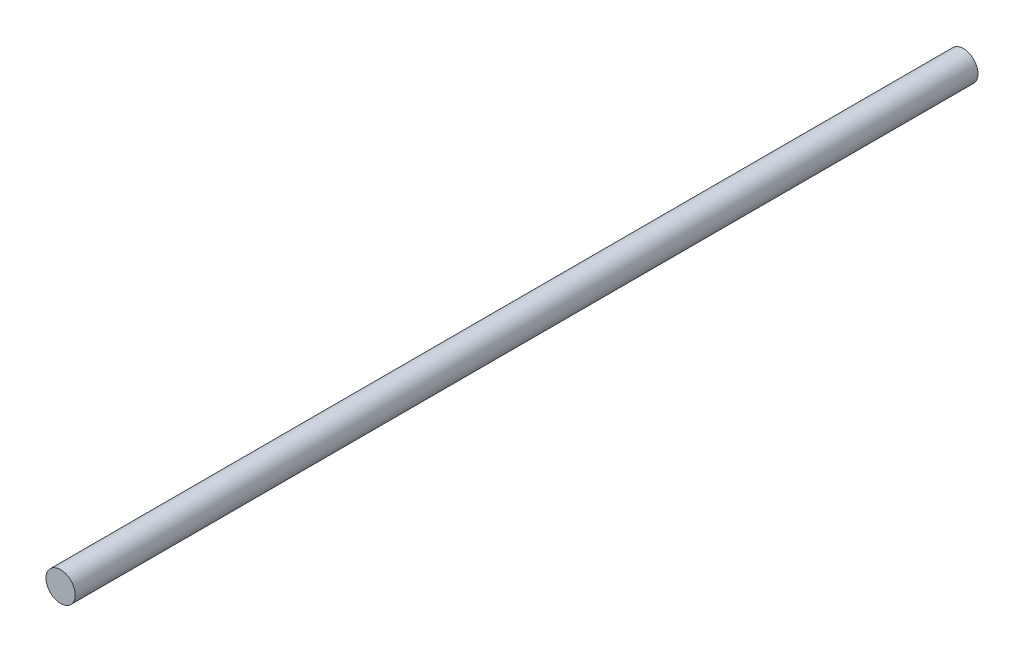
ISO-10303-21;
HEADER;
FILE_DESCRIPTION(('STEP AP214'),'2;1');
FILE_NAME('part.step','',(''),(''),'','','');
FILE_SCHEMA(('AUTOMOTIVE_DESIGN { 1 0 10303 214 1 1 1 1 }'));
ENDSEC;
DATA;
#1=APPLICATION_CONTEXT('core data for automotive mechanical design processes');
#2=APPLICATION_PROTOCOL_DEFINITION('international standard','automotive_design',2000,#1);
#3=PRODUCT_CONTEXT('',#1,'mechanical');
#4=PRODUCT('Part','Part','',(#3));
#5=PRODUCT_RELATED_PRODUCT_CATEGORY('part','',(#4));
#6=PRODUCT_DEFINITION_FORMATION('','',#4);
#7=PRODUCT_DEFINITION_CONTEXT('part definition',#1,'design');
#8=PRODUCT_DEFINITION('design','',#6,#7);
#9=PRODUCT_DEFINITION_SHAPE('','',#8);
#10=(LENGTH_UNIT() NAMED_UNIT(*) SI_UNIT(.MILLI.,.METRE.));
#11=(NAMED_UNIT(*) PLANE_ANGLE_UNIT() SI_UNIT($,.RADIAN.));
#12=(NAMED_UNIT(*) SI_UNIT($,.STERADIAN.) SOLID_ANGLE_UNIT());
#13=UNCERTAINTY_MEASURE_WITH_UNIT(LENGTH_MEASURE(1.E-05),#10,'distance_accuracy_value','');
#14=(GEOMETRIC_REPRESENTATION_CONTEXT(3) GLOBAL_UNCERTAINTY_ASSIGNED_CONTEXT((#13)) GLOBAL_UNIT_ASSIGNED_CONTEXT((#10,
#11,#12)) REPRESENTATION_CONTEXT('',''));
#15=CARTESIAN_POINT('',(0.,0.,0.));
#16=DIRECTION('',(0.,0.,1.));
#17=DIRECTION('',(1.,0.,0.));
#18=AXIS2_PLACEMENT_3D('',#15,#16,#17);
#19=CARTESIAN_POINT('',(0.,0.,185.));
#20=DIRECTION('',(0.,0.,-1.));
#21=DIRECTION('',(-1.,0.,0.));
#22=AXIS2_PLACEMENT_3D('',#19,#20,#21);
#23=CYLINDRICAL_SURFACE('',#22,3.);
#24=CARTESIAN_POINT('',(0.,0.,185.));
#25=DIRECTION('',(0.,0.,1.));
#26=DIRECTION('',(1.,0.,0.));
#27=AXIS2_PLACEMENT_3D('',#24,#25,#26);
#28=CIRCLE('',#27,3.);
#29=CARTESIAN_POINT('',(3.,0.,185.));
#30=VERTEX_POINT('',#29);
#31=EDGE_CURVE('E10',#30,#30,#28,.T.);
#32=ORIENTED_EDGE('',*,*,#31,.F.);
#33=EDGE_LOOP('',(#32));
#34=FACE_BOUND('',#33,.T.);
#35=CARTESIAN_POINT('',(0.,0.,0.));
#36=DIRECTION('',(0.,0.,1.));
#37=DIRECTION('',(1.,0.,0.));
#38=AXIS2_PLACEMENT_3D('',#35,#36,#37);
#39=CIRCLE('',#38,3.);
#40=CARTESIAN_POINT('',(3.,0.,0.));
#41=VERTEX_POINT('',#40);
#42=EDGE_CURVE('E33',#41,#41,#39,.T.);
#43=ORIENTED_EDGE('',*,*,#42,.T.);
#44=EDGE_LOOP('',(#43));
#45=FACE_BOUND('',#44,.T.);
#46=ADVANCED_FACE('F30',(#34,#45),#23,.T.);
#47=CARTESIAN_POINT('',(0.,0.,185.));
#48=DIRECTION('',(0.,0.,1.));
#49=DIRECTION('',(1.,0.,0.));
#50=AXIS2_PLACEMENT_3D('',#47,#48,#49);
#51=PLANE('',#50);
#52=ORIENTED_EDGE('',*,*,#31,.T.);
#53=EDGE_LOOP('',(#52));
#54=FACE_BOUND('',#53,.T.);
#55=ADVANCED_FACE('F45',(#54),#51,.T.);
#56=CARTESIAN_POINT('',(0.,0.,0.));
#57=DIRECTION('',(0.,0.,1.));
#58=DIRECTION('',(1.,0.,0.));
#59=AXIS2_PLACEMENT_3D('',#56,#57,#58);
#60=PLANE('',#59);
#61=ORIENTED_EDGE('',*,*,#42,.F.);
#62=EDGE_LOOP('',(#61));
#63=FACE_BOUND('',#62,.T.);
#64=ADVANCED_FACE('F43',(#63),#60,.F.);
#65=CLOSED_SHELL('',(#46,#55,#64));
#66=MANIFOLD_SOLID_BREP('B2',#65);
#67=ADVANCED_BREP_SHAPE_REPRESENTATION('',(#18,#66),#14);
#68=SHAPE_DEFINITION_REPRESENTATION(#9,#67);
ENDSEC;
END-ISO-10303-21;
